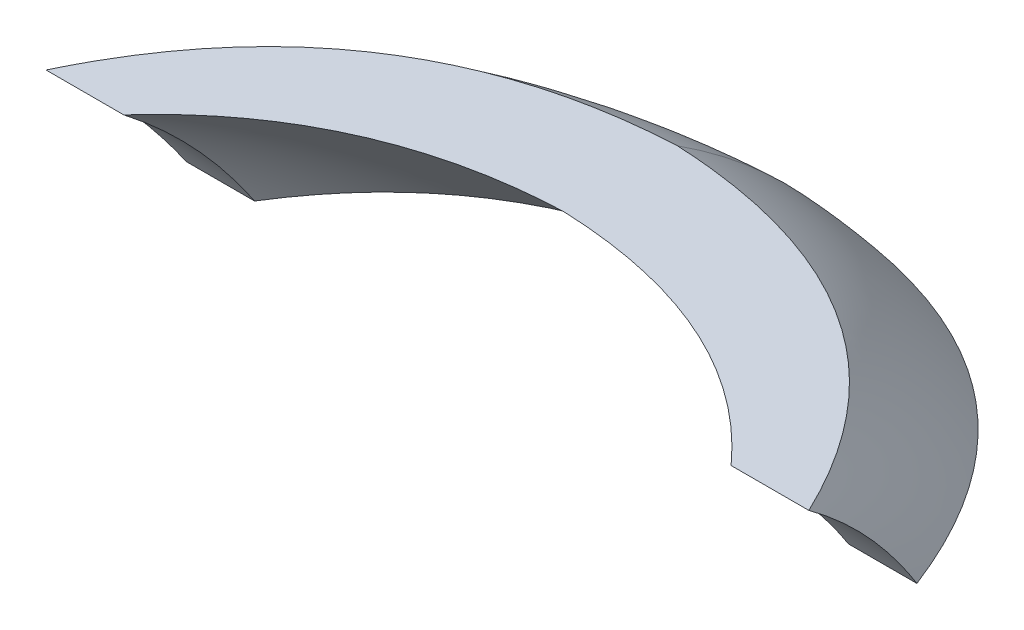
ISO-10303-21;
HEADER;
FILE_DESCRIPTION(('STEP AP214'),'2;1');
FILE_NAME('part.step','',(''),(''),'','','');
FILE_SCHEMA(('AUTOMOTIVE_DESIGN { 1 0 10303 214 1 1 1 1 }'));
ENDSEC;
DATA;
#1=APPLICATION_CONTEXT('core data for automotive mechanical design processes');
#2=APPLICATION_PROTOCOL_DEFINITION('international standard','automotive_design',2000,#1);
#3=PRODUCT_CONTEXT('',#1,'mechanical');
#4=PRODUCT('Part','Part','',(#3));
#5=PRODUCT_RELATED_PRODUCT_CATEGORY('part','',(#4));
#6=PRODUCT_DEFINITION_FORMATION('','',#4);
#7=PRODUCT_DEFINITION_CONTEXT('part definition',#1,'design');
#8=PRODUCT_DEFINITION('design','',#6,#7);
#9=PRODUCT_DEFINITION_SHAPE('','',#8);
#10=(LENGTH_UNIT() NAMED_UNIT(*) SI_UNIT(.MILLI.,.METRE.));
#11=(NAMED_UNIT(*) PLANE_ANGLE_UNIT() SI_UNIT($,.RADIAN.));
#12=(NAMED_UNIT(*) SI_UNIT($,.STERADIAN.) SOLID_ANGLE_UNIT());
#13=UNCERTAINTY_MEASURE_WITH_UNIT(LENGTH_MEASURE(1.E-05),#10,'distance_accuracy_value','');
#14=(GEOMETRIC_REPRESENTATION_CONTEXT(3) GLOBAL_UNCERTAINTY_ASSIGNED_CONTEXT((#13)) GLOBAL_UNIT_ASSIGNED_CONTEXT((#10,
#11,#12)) REPRESENTATION_CONTEXT('',''));
#15=CARTESIAN_POINT('',(0.,0.,0.));
#16=DIRECTION('',(0.,0.,1.));
#17=DIRECTION('',(1.,0.,0.));
#18=AXIS2_PLACEMENT_3D('',#15,#16,#17);
#19=CARTESIAN_POINT('',(1016.93008059215,1447.99219123021,-15258.5674810014));
#20=DIRECTION('',(0.,1.,0.));
#21=DIRECTION('',(0.,0.,1.));
#22=AXIS2_PLACEMENT_3D('',#19,#20,#21);
#23=PLANE('',#22);
#24=CARTESIAN_POINT('',(1656.78813136322,1447.99219123021,-14363.4829944068));
#25=CARTESIAN_POINT('',(1205.46609550268,1447.99219123021,-15527.7011901592));
#26=CARTESIAN_POINT('',(0.,1447.99219123021,-15615.3845492803));
#27=B_SPLINE_CURVE_WITH_KNOTS('',2,(#24,#25,#26),.UNSPECIFIED.,.F.,.F.,(3,3),(0.,1.),.UNSPECIFIED.);
#28=CARTESIAN_POINT('',(1656.78813136322,1447.99219123021,-14363.4829944068));
#29=VERTEX_POINT('',#28);
#30=CARTESIAN_POINT('',(0.,1447.99219123021,-15615.3845492803));
#31=VERTEX_POINT('',#30);
#32=EDGE_CURVE('E464',#29,#31,#27,.T.);
#33=ORIENTED_EDGE('',*,*,#32,.F.);
#34=DIRECTION('',(1.,0.,0.));
#35=VECTOR('',#34,1.);
#36=CARTESIAN_POINT('',(1656.78813136322,1447.99219123021,-14363.4829944068));
#37=LINE('',#36,#35);
#38=CARTESIAN_POINT('',(1346.84741369142,1447.99219123021,-14363.4829944068));
#39=VERTEX_POINT('',#38);
#40=EDGE_CURVE('E633',#39,#29,#37,.T.);
#41=ORIENTED_EDGE('',*,*,#40,.F.);
#42=CARTESIAN_POINT('',(6.90058207712369E-13,1447.99219123021,-15180.0888616126));
#43=CARTESIAN_POINT('',(892.254112882625,1447.99219123021,-15093.5273384483));
#44=CARTESIAN_POINT('',(1346.84741369142,1447.99219123021,-14363.4829944068));
#45=B_SPLINE_CURVE_WITH_KNOTS('',2,(#42,#43,#44),.UNSPECIFIED.,.F.,.F.,(3,3),(0.,1.),.UNSPECIFIED.);
#46=CARTESIAN_POINT('',(8.88178419700125E-13,1447.99219123021,-15180.0888616126));
#47=VERTEX_POINT('',#46);
#48=EDGE_CURVE('E760',#47,#39,#45,.T.);
#49=ORIENTED_EDGE('',*,*,#48,.F.);
#50=CARTESIAN_POINT('',(-1346.84741369142,1447.99219123021,-14363.4829944068));
#51=CARTESIAN_POINT('',(-892.254112882625,1447.99219123021,-15093.5273384483));
#52=CARTESIAN_POINT('',(8.88178419700125E-13,1447.99219123021,-15180.0888616126));
#53=B_SPLINE_CURVE_WITH_KNOTS('',2,(#50,#51,#52),.UNSPECIFIED.,.F.,.F.,(3,3),(0.,1.),.UNSPECIFIED.);
#54=CARTESIAN_POINT('',(-1346.84741369142,1447.99219123021,-14363.4829944068));
#55=VERTEX_POINT('',#54);
#56=EDGE_CURVE('E767',#55,#47,#53,.T.);
#57=ORIENTED_EDGE('',*,*,#56,.F.);
#58=DIRECTION('',(1.,0.,0.));
#59=VECTOR('',#58,1.);
#60=CARTESIAN_POINT('',(-1656.78813136322,1447.99219123021,-14363.4829944068));
#61=LINE('',#60,#59);
#62=CARTESIAN_POINT('',(-1656.78813136322,1447.99219123021,-14363.4829944068));
#63=VERTEX_POINT('',#62);
#64=EDGE_CURVE('E409',#63,#55,#61,.T.);
#65=ORIENTED_EDGE('',*,*,#64,.F.);
#66=CARTESIAN_POINT('',(0.,1447.99219123021,-15615.3845492803));
#67=CARTESIAN_POINT('',(-1205.46609550268,1447.99219123021,-15527.7011901592));
#68=CARTESIAN_POINT('',(-1656.78813136322,1447.99219123021,-14363.4829944068));
#69=B_SPLINE_CURVE_WITH_KNOTS('',2,(#66,#67,#68),.UNSPECIFIED.,.F.,.F.,(3,3),(0.,1.),.UNSPECIFIED.);
#70=EDGE_CURVE('E13',#31,#63,#69,.T.);
#71=ORIENTED_EDGE('',*,*,#70,.F.);
#72=EDGE_LOOP('',(#33,#41,#49,#57,#65,#71));
#73=FACE_BOUND('',#72,.T.);
#74=ADVANCED_FACE('F399',(#73),#23,.F.);
#75=CARTESIAN_POINT('',(1040.25370740718,2052.62960614324,-14622.6430667593));
#76=DIRECTION('',(0.,1.,0.));
#77=DIRECTION('',(0.,0.,1.));
#78=AXIS2_PLACEMENT_3D('',#75,#76,#77);
#79=PLANE('',#78);
#80=CARTESIAN_POINT('',(1729.62097170329,2052.62960614324,-13800.6828504846));
#81=CARTESIAN_POINT('',(1215.69692896272,2052.62960614324,-14877.7168144984));
#82=CARTESIAN_POINT('',(0.,2052.62960614324,-14934.4557875557));
#83=B_SPLINE_CURVE_WITH_KNOTS('',2,(#80,#81,#82),.UNSPECIFIED.,.F.,.F.,(3,3),(0.,1.),.UNSPECIFIED.);
#84=CARTESIAN_POINT('',(1729.62097170329,2052.62960614324,-13800.6828504846));
#85=VERTEX_POINT('',#84);
#86=CARTESIAN_POINT('',(0.,2052.62960614324,-14934.4557875557));
#87=VERTEX_POINT('',#86);
#88=EDGE_CURVE('E461',#85,#87,#83,.T.);
#89=ORIENTED_EDGE('',*,*,#88,.T.);
#90=CARTESIAN_POINT('',(0.,2052.62960614324,-14934.4557875557));
#91=CARTESIAN_POINT('',(-1215.69692896272,2052.62960614324,-14877.7168144984));
#92=CARTESIAN_POINT('',(-1729.62097170329,2052.62960614324,-13800.6828504846));
#93=B_SPLINE_CURVE_WITH_KNOTS('',2,(#90,#91,#92),.UNSPECIFIED.,.F.,.F.,(3,3),(0.,1.),.UNSPECIFIED.);
#94=CARTESIAN_POINT('',(-1729.62097170329,2052.62960614324,-13800.6828504846));
#95=VERTEX_POINT('',#94);
#96=EDGE_CURVE('E468',#87,#95,#93,.T.);
#97=ORIENTED_EDGE('',*,*,#96,.T.);
#98=DIRECTION('',(1.,0.,0.));
#99=VECTOR('',#98,1.);
#100=CARTESIAN_POINT('',(-1729.62097170329,2052.62960614324,-13800.6828504846));
#101=LINE('',#100,#99);
#102=CARTESIAN_POINT('',(-1377.14288614841,2052.62960614324,-13800.6828504846));
#103=VERTEX_POINT('',#102);
#104=EDGE_CURVE('E474',#95,#103,#101,.T.);
#105=ORIENTED_EDGE('',*,*,#104,.T.);
#106=CARTESIAN_POINT('',(-1377.14288614841,2052.62960614324,-13800.6828504846));
#107=CARTESIAN_POINT('',(-850.648259402485,2052.62960614324,-14385.325069701));
#108=CARTESIAN_POINT('',(0.,2052.62960614324,-14418.383322118));
#109=B_SPLINE_CURVE_WITH_KNOTS('',2,(#106,#107,#108),.UNSPECIFIED.,.F.,.F.,(3,3),(0.,1.),.UNSPECIFIED.);
#110=CARTESIAN_POINT('',(0.,2052.62960614324,-14418.383322118));
#111=VERTEX_POINT('',#110);
#112=EDGE_CURVE('E539',#103,#111,#109,.T.);
#113=ORIENTED_EDGE('',*,*,#112,.T.);
#114=CARTESIAN_POINT('',(0.,2052.62960614324,-14418.383322118));
#115=CARTESIAN_POINT('',(850.648259402486,2052.62960614324,-14385.325069701));
#116=CARTESIAN_POINT('',(1377.14288614841,2052.62960614324,-13800.6828504846));
#117=B_SPLINE_CURVE_WITH_KNOTS('',2,(#114,#115,#116),.UNSPECIFIED.,.F.,.F.,(3,3),(0.,1.),.UNSPECIFIED.);
#118=CARTESIAN_POINT('',(1377.14288614841,2052.62960614324,-13800.6828504846));
#119=VERTEX_POINT('',#118);
#120=EDGE_CURVE('E538',#111,#119,#117,.T.);
#121=ORIENTED_EDGE('',*,*,#120,.T.);
#122=DIRECTION('',(1.,0.,0.));
#123=VECTOR('',#122,1.);
#124=CARTESIAN_POINT('',(1729.62097170329,2052.62960614324,-13800.6828504846));
#125=LINE('',#124,#123);
#126=EDGE_CURVE('E480',#119,#85,#125,.T.);
#127=ORIENTED_EDGE('',*,*,#126,.T.);
#128=EDGE_LOOP('',(#89,#97,#105,#113,#121,#127));
#129=FACE_BOUND('',#128,.T.);
#130=ADVANCED_FACE('F478',(#129),#79,.T.);
#131=CARTESIAN_POINT('',(-1729.62097170329,2052.62960614324,-13800.6828504846));
#132=CARTESIAN_POINT('',(-1705.3433582566,1892.12507808438,-14010.5968788398));
#133=CARTESIAN_POINT('',(-1681.06574480991,1694.40801554914,-14201.1676975908));
#134=CARTESIAN_POINT('',(-1656.78813136322,1447.99219123021,-14363.4829944068));
#135=CARTESIAN_POINT('',(-1643.96696457986,2052.62960614324,-13980.1885111536));
#136=CARTESIAN_POINT('',(-1623.16724040428,1892.12507808438,-14194.9461079386));
#137=CARTESIAN_POINT('',(-1602.36751622871,1694.40801554914,-14390.3604951196));
#138=CARTESIAN_POINT('',(-1581.56779205313,1447.99219123021,-14557.5193603656));
#139=CARTESIAN_POINT('',(-1443.41841340709,2052.62960614326,-14296.6875412017));
#140=CARTESIAN_POINT('',(-1428.84709036513,1892.12507808438,-14520.3511658789));
#141=CARTESIAN_POINT('',(-1414.27576732317,1694.40801554914,-14724.6715809519));
#142=CARTESIAN_POINT('',(-1399.70444428121,1447.99219123021,-14900.73647409));
#143=CARTESIAN_POINT('',(-1054.87397587013,2052.62960614324,-14643.8992124042));
#144=CARTESIAN_POINT('',(-1047.46312230276,1892.12507808438,-14878.5785520165));
#145=CARTESIAN_POINT('',(-1040.05226873539,1694.40801554915,-15093.9146820247));
#146=CARTESIAN_POINT('',(-1032.64141516802,1447.99219123022,-15280.9952900979));
#147=CARTESIAN_POINT('',(-578.607927555448,2052.62960614325,-14863.5740097374));
#148=CARTESIAN_POINT('',(-576.17541123683,1892.12507808439,-15106.9257373816));
#149=CARTESIAN_POINT('',(-573.742894918213,1694.40801554915,-15330.9342554218));
#150=CARTESIAN_POINT('',(-571.310378599595,1447.99219123022,-15526.6872515269));
#151=CARTESIAN_POINT('',(-202.61615482712,2052.62960614324,-14924.9992920462));
#152=CARTESIAN_POINT('',(-202.047775190451,1892.12507808438,-15172.5703937763));
#153=CARTESIAN_POINT('',(-201.479395553783,1694.40801554914,-15400.7982859024));
#154=CARTESIAN_POINT('',(-200.911015917114,1447.99219123021,-15600.7706560934));
#155=CARTESIAN_POINT('',(0.,2052.62960614324,-14934.4557875557));
#156=CARTESIAN_POINT('',(0.,1892.12507808438,-15183.746021845));
#157=CARTESIAN_POINT('',(0.,1694.40801554914,-15413.6930465301));
#158=CARTESIAN_POINT('',(0.,1447.99219123021,-15615.3845492803));
#159=B_SPLINE_SURFACE_WITH_KNOTS('',3,3,((#131,#132,#133,#134),(#135,#136,#137,#138),(#139,#140,
#141,#142),(#143,#144,#145,#146),(#147,#148,#149,#150),(#151,#152,#153,#154),(#155,#156,#157,
#158)),.UNSPECIFIED.,.F.,.F.,.F.,(4,1,1,1,4),(4,4),(0.733582610380399,0.800186957785299,
0.8667913051902,0.9333956525951,1.),(0.,1.),.UNSPECIFIED.);
#160=CARTESIAN_POINT('',(0.,2052.62960614324,-14934.4557875557));
#161=CARTESIAN_POINT('',(0.,1892.12507808438,-15183.746021845));
#162=CARTESIAN_POINT('',(0.,1694.40801554914,-15413.6930465301));
#163=CARTESIAN_POINT('',(0.,1447.99219123021,-15615.3845492803));
#164=B_SPLINE_CURVE_WITH_KNOTS('',3,(#160,#161,#162,#163),.UNSPECIFIED.,.F.,.F.,(4,4),(0.,1.),.UNSPECIFIED.);
#165=EDGE_CURVE('E456',#87,#31,#164,.T.);
#166=CARTESIAN_POINT('',(-1729.62097170329,2052.62960614324,-13800.6828504846));
#167=CARTESIAN_POINT('',(-1705.3433582566,1892.12507808438,-14010.5968788398));
#168=CARTESIAN_POINT('',(-1681.06574480991,1694.40801554914,-14201.1676975908));
#169=CARTESIAN_POINT('',(-1656.78813136322,1447.99219123021,-14363.4829944068));
#170=B_SPLINE_CURVE_WITH_KNOTS('',3,(#166,#167,#168,#169),.UNSPECIFIED.,.F.,.F.,(4,4),(0.,1.),.UNSPECIFIED.);
#171=EDGE_CURVE('E417',#95,#63,#170,.T.);
#172=ORIENTED_EDGE('',*,*,#96,.F.);
#173=ORIENTED_EDGE('',*,*,#165,.T.);
#174=ORIENTED_EDGE('',*,*,#70,.T.);
#175=ORIENTED_EDGE('',*,*,#171,.F.);
#176=EDGE_LOOP('',(#172,#173,#174,#175));
#177=FACE_BOUND('',#176,.T.);
#178=ADVANCED_FACE('F470',(#177),#159,.T.);
#179=CARTESIAN_POINT('',(-1377.14288614841,2052.62960614324,-13800.6828504846));
#180=CARTESIAN_POINT('',(-1367.04439532941,1892.12507808438,-14010.5968788398));
#181=CARTESIAN_POINT('',(-1356.94590451041,1694.40801554914,-14201.1676975908));
#182=CARTESIAN_POINT('',(-1346.84741369142,1447.99219123021,-14363.4829944068));
#183=CARTESIAN_POINT('',(-1406.51605994465,2052.62960614324,-13800.6828504846));
#184=CARTESIAN_POINT('',(-1395.23597557334,1892.12507808438,-14010.5968788398));
#185=CARTESIAN_POINT('',(-1383.95589120204,1694.40801554914,-14201.1676975908));
#186=CARTESIAN_POINT('',(-1372.67580683073,1447.99219123021,-14363.4829944068));
#187=CARTESIAN_POINT('',(-1465.26240753713,2052.62960614324,-13800.6828504846));
#188=CARTESIAN_POINT('',(-1451.61913606121,1892.12507808438,-14010.5968788398));
#189=CARTESIAN_POINT('',(-1437.97586458529,1694.40801554914,-14201.1676975908));
#190=CARTESIAN_POINT('',(-1424.33259310937,1447.99219123021,-14363.4829944068));
#191=CARTESIAN_POINT('',(-1553.38192892585,2052.62960614324,-13800.6828504846));
#192=CARTESIAN_POINT('',(-1536.19387679301,1892.12507808438,-14010.5968788398));
#193=CARTESIAN_POINT('',(-1519.00582466016,1694.40801554914,-14201.1676975908));
#194=CARTESIAN_POINT('',(-1501.81777252732,1447.99219123021,-14363.4829944068));
#195=CARTESIAN_POINT('',(-1641.50145031457,2052.62960614324,-13800.6828504846));
#196=CARTESIAN_POINT('',(-1620.7686175248,1892.12507808438,-14010.5968788398));
#197=CARTESIAN_POINT('',(-1600.03578473504,1694.40801554914,-14201.1676975908));
#198=CARTESIAN_POINT('',(-1579.30295194527,1447.99219123021,-14363.4829944068));
#199=CARTESIAN_POINT('',(-1700.24779790705,2052.62960614324,-13800.6828504846));
#200=CARTESIAN_POINT('',(-1677.15177801267,1892.12507808438,-14010.5968788398));
#201=CARTESIAN_POINT('',(-1654.05575811828,1694.40801554914,-14201.1676975908));
#202=CARTESIAN_POINT('',(-1630.9597382239,1447.99219123021,-14363.4829944068));
#203=CARTESIAN_POINT('',(-1729.62097170329,2052.62960614324,-13800.6828504846));
#204=CARTESIAN_POINT('',(-1705.3433582566,1892.12507808438,-14010.5968788398));
#205=CARTESIAN_POINT('',(-1681.06574480991,1694.40801554914,-14201.1676975908));
#206=CARTESIAN_POINT('',(-1656.78813136322,1447.99219123021,-14363.4829944068));
#207=B_SPLINE_SURFACE_WITH_KNOTS('',3,3,((#179,#180,#181,#182),(#183,#184,#185,#186),(#187,#188,
#189,#190),(#191,#192,#193,#194),(#195,#196,#197,#198),(#199,#200,#201,#202),(#203,#204,#205,
#206)),.UNSPECIFIED.,.F.,.F.,.F.,(4,1,1,1,4),(4,4),(0.693392669124958,0.703440154438818,
0.713487639752678,0.723535125066539,0.733582610380399),(0.,1.),.UNSPECIFIED.);
#208=CARTESIAN_POINT('',(-1377.14288614841,2052.62960614324,-13800.6828504846));
#209=CARTESIAN_POINT('',(-1367.04439532941,1892.12507808438,-14010.5968788398));
#210=CARTESIAN_POINT('',(-1356.94590451041,1694.40801554914,-14201.1676975908));
#211=CARTESIAN_POINT('',(-1346.84741369142,1447.99219123021,-14363.4829944068));
#212=B_SPLINE_CURVE_WITH_KNOTS('',3,(#208,#209,#210,#211),.UNSPECIFIED.,.F.,.F.,(4,4),(0.,1.),.UNSPECIFIED.);
#213=EDGE_CURVE('E694',#103,#55,#212,.T.);
#214=ORIENTED_EDGE('',*,*,#104,.F.);
#215=ORIENTED_EDGE('',*,*,#171,.T.);
#216=ORIENTED_EDGE('',*,*,#64,.T.);
#217=ORIENTED_EDGE('',*,*,#213,.F.);
#218=EDGE_LOOP('',(#214,#215,#216,#217));
#219=FACE_BOUND('',#218,.T.);
#220=ADVANCED_FACE('F576',(#219),#207,.T.);
#221=CARTESIAN_POINT('',(0.,2052.62960614324,-14418.383322118));
#222=CARTESIAN_POINT('',(2.96059473233375E-13,1892.12507808438,-14694.5991489973));
#223=CARTESIAN_POINT('',(5.9211894646675E-13,1694.40801554914,-14951.4717662724));
#224=CARTESIAN_POINT('',(8.88178419700125E-13,1447.99219123021,-15180.0888616126));
#225=CARTESIAN_POINT('',(-141.774709900414,2052.62960614324,-14412.8736133818));
#226=CARTESIAN_POINT('',(-144.086146204866,1892.12507808438,-14686.1170363307));
#227=CARTESIAN_POINT('',(-146.397582509318,1694.40801554914,-14940.0172496755));
#228=CARTESIAN_POINT('',(-148.70901881377,1447.99219123021,-15165.6619410852));
#229=CARTESIAN_POINT('',(-411.81772834055,2052.62960614325,-14378.8715306262));
#230=CARTESIAN_POINT('',(-417.175548650888,1892.12507808438,-14644.893772741));
#231=CARTESIAN_POINT('',(-422.533368961226,1694.40801554914,-14891.5728052516));
#232=CARTESIAN_POINT('',(-427.891189271564,1447.99219123021,-15109.9963158272));
#233=CARTESIAN_POINT('',(-776.363051918693,2052.62960614325,-14258.9204106428));
#234=CARTESIAN_POINT('',(-781.560982428811,1892.12507808439,-14510.2817625866));
#235=CARTESIAN_POINT('',(-786.758912938928,1694.40801554915,-14742.2999049261));
#236=CARTESIAN_POINT('',(-791.956843449045,1447.99219123023,-14946.0625253307));
#237=CARTESIAN_POINT('',(-1100.38917141476,2052.62960614325,-14070.0212948096));
#238=CARTESIAN_POINT('',(-1100.6977463156,1892.12507808438,-14302.8926376623));
#239=CARTESIAN_POINT('',(-1101.00632121644,1694.40801554914,-14516.4207709108));
#240=CARTESIAN_POINT('',(-1101.31489611728,1447.99219123021,-14701.6933822244));
#241=CARTESIAN_POINT('',(-1289.39378169075,2052.62960614324,-13898.123220354));
#242=CARTESIAN_POINT('',(-1283.28980897938,1892.12507808438,-14116.1151445328));
#243=CARTESIAN_POINT('',(-1277.185836268,1694.40801554914,-14314.7638591074));
#244=CARTESIAN_POINT('',(-1271.08186355662,1447.99219123021,-14485.1570517471));
#245=CARTESIAN_POINT('',(-1377.14288614841,2052.62960614324,-13800.6828504846));
#246=CARTESIAN_POINT('',(-1367.04439532941,1892.12507808438,-14010.5968788398));
#247=CARTESIAN_POINT('',(-1356.94590451041,1694.40801554914,-14201.1676975908));
#248=CARTESIAN_POINT('',(-1346.84741369142,1447.99219123021,-14363.4829944068));
#249=B_SPLINE_SURFACE_WITH_KNOTS('',3,3,((#221,#222,#223,#224),(#225,#226,#227,#228),(#229,#230,
#231,#232),(#233,#234,#235,#236),(#237,#238,#239,#240),(#241,#242,#243,#244),(#245,#246,#247,
#248)),.UNSPECIFIED.,.F.,.F.,.F.,(4,1,1,1,4),(4,4),(0.499999835116255,0.548348043618431,
0.596696252120607,0.645044460622782,0.693392669124958),(0.,1.),.UNSPECIFIED.);
#250=CARTESIAN_POINT('',(0.,2052.62960614324,-14418.383322118));
#251=CARTESIAN_POINT('',(2.96059473233375E-13,1892.12507808438,-14694.5991489973));
#252=CARTESIAN_POINT('',(5.9211894646675E-13,1694.40801554914,-14951.4717662724));
#253=CARTESIAN_POINT('',(8.88178419700125E-13,1447.99219123021,-15180.0888616126));
#254=B_SPLINE_CURVE_WITH_KNOTS('',3,(#250,#251,#252,#253),.UNSPECIFIED.,.F.,.F.,(4,4),(0.,1.),.UNSPECIFIED.);
#255=EDGE_CURVE('E671',#111,#47,#254,.T.);
#256=ORIENTED_EDGE('',*,*,#112,.F.);
#257=ORIENTED_EDGE('',*,*,#213,.T.);
#258=ORIENTED_EDGE('',*,*,#56,.T.);
#259=ORIENTED_EDGE('',*,*,#255,.F.);
#260=EDGE_LOOP('',(#256,#257,#258,#259));
#261=FACE_BOUND('',#260,.T.);
#262=ADVANCED_FACE('F587',(#261),#249,.T.);
#263=CARTESIAN_POINT('',(1377.14288614841,2052.62960614324,-13800.6828504846));
#264=CARTESIAN_POINT('',(1367.04439532941,1892.12507808438,-14010.5968788398));
#265=CARTESIAN_POINT('',(1356.94590451041,1694.40801554914,-14201.1676975908));
#266=CARTESIAN_POINT('',(1346.84741369142,1447.99219123021,-14363.4829944068));
#267=CARTESIAN_POINT('',(1289.39378169075,2052.62960614324,-13898.123220354));
#268=CARTESIAN_POINT('',(1283.28980897938,1892.12507808438,-14116.1151445328));
#269=CARTESIAN_POINT('',(1277.185836268,1694.40801554914,-14314.7638591074));
#270=CARTESIAN_POINT('',(1271.08186355662,1447.99219123021,-14485.1570517471));
#271=CARTESIAN_POINT('',(1100.38917141476,2052.62960614325,-14070.0212948096));
#272=CARTESIAN_POINT('',(1100.6977463156,1892.12507808438,-14302.8926376623));
#273=CARTESIAN_POINT('',(1101.00632121644,1694.40801554915,-14516.4207709108));
#274=CARTESIAN_POINT('',(1101.31489611728,1447.99219123021,-14701.6933822243));
#275=CARTESIAN_POINT('',(776.363051918693,2052.62960614325,-14258.9204106428));
#276=CARTESIAN_POINT('',(781.560982428808,1892.12507808438,-14510.2817625865));
#277=CARTESIAN_POINT('',(786.758912938924,1694.40801554915,-14742.2999049261));
#278=CARTESIAN_POINT('',(791.95684344904,1447.99219123022,-14946.0625253307));
#279=CARTESIAN_POINT('',(411.817728340555,2052.62960614325,-14378.8715306263));
#280=CARTESIAN_POINT('',(417.175548650894,1892.12507808439,-14644.8937727411));
#281=CARTESIAN_POINT('',(422.533368961233,1694.40801554915,-14891.5728052517));
#282=CARTESIAN_POINT('',(427.891189271572,1447.99219123022,-15109.9963158274));
#283=CARTESIAN_POINT('',(141.774709900414,2052.62960614324,-14412.8736133818));
#284=CARTESIAN_POINT('',(144.086146204867,1892.12507808438,-14686.1170363307));
#285=CARTESIAN_POINT('',(146.397582509319,1694.40801554914,-14940.0172496755));
#286=CARTESIAN_POINT('',(148.709018813771,1447.99219123021,-15165.6619410852));
#287=CARTESIAN_POINT('',(0.,2052.62960614324,-14418.383322118));
#288=CARTESIAN_POINT('',(2.96059473233375E-13,1892.12507808438,-14694.5991489973));
#289=CARTESIAN_POINT('',(5.9211894646675E-13,1694.40801554914,-14951.4717662724));
#290=CARTESIAN_POINT('',(8.88178419700125E-13,1447.99219123021,-15180.0888616126));
#291=B_SPLINE_SURFACE_WITH_KNOTS('',3,3,((#263,#264,#265,#266),(#267,#268,#269,#270),(#271,#272,
#273,#274),(#275,#276,#277,#278),(#279,#280,#281,#282),(#283,#284,#285,#286),(#287,#288,#289,
#290)),.UNSPECIFIED.,.F.,.F.,.F.,(4,1,1,1,4),(4,4),(0.30660732151696,0.354955449916784,
0.403303578316608,0.451651706716432,0.499999835116255),(0.,1.),.UNSPECIFIED.);
#292=CARTESIAN_POINT('',(1377.14288614841,2052.62960614324,-13800.6828504846));
#293=CARTESIAN_POINT('',(1367.04439532941,1892.12507808438,-14010.5968788398));
#294=CARTESIAN_POINT('',(1356.94590451041,1694.40801554914,-14201.1676975908));
#295=CARTESIAN_POINT('',(1346.84741369142,1447.99219123021,-14363.4829944068));
#296=B_SPLINE_CURVE_WITH_KNOTS('',3,(#292,#293,#294,#295),.UNSPECIFIED.,.F.,.F.,(4,4),(0.,1.),.UNSPECIFIED.);
#297=EDGE_CURVE('E664',#119,#39,#296,.T.);
#298=ORIENTED_EDGE('',*,*,#120,.F.);
#299=ORIENTED_EDGE('',*,*,#255,.T.);
#300=ORIENTED_EDGE('',*,*,#48,.T.);
#301=ORIENTED_EDGE('',*,*,#297,.F.);
#302=EDGE_LOOP('',(#298,#299,#300,#301));
#303=FACE_BOUND('',#302,.T.);
#304=ADVANCED_FACE('F648',(#303),#291,.T.);
#305=CARTESIAN_POINT('',(1729.62097170329,2052.62960614324,-13800.6828504846));
#306=CARTESIAN_POINT('',(1705.3433582566,1892.12507808438,-14010.5968788398));
#307=CARTESIAN_POINT('',(1681.06574480991,1694.40801554914,-14201.1676975908));
#308=CARTESIAN_POINT('',(1656.78813136322,1447.99219123021,-14363.4829944068));
#309=CARTESIAN_POINT('',(1700.24779790705,2052.62960614324,-13800.6828504846));
#310=CARTESIAN_POINT('',(1677.15177801267,1892.12507808438,-14010.5968788398));
#311=CARTESIAN_POINT('',(1654.05575811828,1694.40801554914,-14201.1676975908));
#312=CARTESIAN_POINT('',(1630.9597382239,1447.99219123021,-14363.4829944068));
#313=CARTESIAN_POINT('',(1641.50145031457,2052.62960614324,-13800.6828504846));
#314=CARTESIAN_POINT('',(1620.7686175248,1892.12507808438,-14010.5968788398));
#315=CARTESIAN_POINT('',(1600.03578473504,1694.40801554914,-14201.1676975908));
#316=CARTESIAN_POINT('',(1579.30295194527,1447.99219123021,-14363.4829944069));
#317=CARTESIAN_POINT('',(1553.38192892585,2052.62960614324,-13800.6828504846));
#318=CARTESIAN_POINT('',(1536.193876793,1892.12507808438,-14010.5968788398));
#319=CARTESIAN_POINT('',(1519.00582466016,1694.40801554914,-14201.1676975908));
#320=CARTESIAN_POINT('',(1501.81777252732,1447.99219123021,-14363.4829944068));
#321=CARTESIAN_POINT('',(1465.26240753713,2052.62960614324,-13800.6828504846));
#322=CARTESIAN_POINT('',(1451.61913606121,1892.12507808438,-14010.5968788398));
#323=CARTESIAN_POINT('',(1437.97586458529,1694.40801554914,-14201.1676975908));
#324=CARTESIAN_POINT('',(1424.33259310937,1447.99219123021,-14363.4829944068));
#325=CARTESIAN_POINT('',(1406.51605994465,2052.62960614324,-13800.6828504846));
#326=CARTESIAN_POINT('',(1395.23597557334,1892.12507808438,-14010.5968788398));
#327=CARTESIAN_POINT('',(1383.95589120204,1694.40801554914,-14201.1676975908));
#328=CARTESIAN_POINT('',(1372.67580683073,1447.99219123021,-14363.4829944068));
#329=CARTESIAN_POINT('',(1377.14288614841,2052.62960614324,-13800.6828504846));
#330=CARTESIAN_POINT('',(1367.04439532941,1892.12507808438,-14010.5968788398));
#331=CARTESIAN_POINT('',(1356.94590451041,1694.40801554914,-14201.1676975908));
#332=CARTESIAN_POINT('',(1346.84741369142,1447.99219123021,-14363.4829944068));
#333=B_SPLINE_SURFACE_WITH_KNOTS('',3,3,((#305,#306,#307,#308),(#309,#310,#311,#312),(#313,#314,
#315,#316),(#317,#318,#319,#320),(#321,#322,#323,#324),(#325,#326,#327,#328),(#329,#330,#331,
#332)),.UNSPECIFIED.,.F.,.F.,.F.,(4,1,1,1,4),(4,4),(0.266417380261519,0.276464865575379,
0.28651235088924,0.2965598362031,0.30660732151696),(0.,1.),.UNSPECIFIED.);
#334=CARTESIAN_POINT('',(1729.62097170329,2052.62960614324,-13800.6828504846));
#335=CARTESIAN_POINT('',(1705.3433582566,1892.12507808438,-14010.5968788398));
#336=CARTESIAN_POINT('',(1681.06574480991,1694.40801554914,-14201.1676975908));
#337=CARTESIAN_POINT('',(1656.78813136322,1447.99219123021,-14363.4829944068));
#338=B_SPLINE_CURVE_WITH_KNOTS('',3,(#334,#335,#336,#337),.UNSPECIFIED.,.F.,.F.,(4,4),(0.,1.),.UNSPECIFIED.);
#339=EDGE_CURVE('E473',#85,#29,#338,.T.);
#340=ORIENTED_EDGE('',*,*,#126,.F.);
#341=ORIENTED_EDGE('',*,*,#297,.T.);
#342=ORIENTED_EDGE('',*,*,#40,.T.);
#343=ORIENTED_EDGE('',*,*,#339,.F.);
#344=EDGE_LOOP('',(#340,#341,#342,#343));
#345=FACE_BOUND('',#344,.T.);
#346=ADVANCED_FACE('F638',(#345),#333,.T.);
#347=CARTESIAN_POINT('',(0.,2052.62960614324,-14934.4557875557));
#348=CARTESIAN_POINT('',(0.,1892.12507808438,-15183.746021845));
#349=CARTESIAN_POINT('',(0.,1694.40801554914,-15413.6930465301));
#350=CARTESIAN_POINT('',(0.,1447.99219123021,-15615.3845492803));
#351=CARTESIAN_POINT('',(202.61615482712,2052.62960614324,-14924.9992920462));
#352=CARTESIAN_POINT('',(202.047775190451,1892.12507808438,-15172.5703937763));
#353=CARTESIAN_POINT('',(201.479395553783,1694.40801554914,-15400.7982859024));
#354=CARTESIAN_POINT('',(200.911015917114,1447.99219123021,-15600.7706560934));
#355=CARTESIAN_POINT('',(578.607927555438,2052.62960614326,-14863.5740097373));
#356=CARTESIAN_POINT('',(576.175411236821,1892.12507808439,-15106.9257373815));
#357=CARTESIAN_POINT('',(573.742894918205,1694.40801554915,-15330.9342554216));
#358=CARTESIAN_POINT('',(571.310378599588,1447.99219123021,-15526.6872515268));
#359=CARTESIAN_POINT('',(1054.87397587014,2052.62960614324,-14643.8992124042));
#360=CARTESIAN_POINT('',(1047.46312230277,1892.12507808438,-14878.5785520165));
#361=CARTESIAN_POINT('',(1040.0522687354,1694.40801554915,-15093.9146820247));
#362=CARTESIAN_POINT('',(1032.64141516802,1447.99219123022,-15280.9952900979));
#363=CARTESIAN_POINT('',(1443.41841340709,2052.62960614326,-14296.6875412017));
#364=CARTESIAN_POINT('',(1428.84709036513,1892.12507808439,-14520.3511658789));
#365=CARTESIAN_POINT('',(1414.27576732317,1694.40801554915,-14724.671580952));
#366=CARTESIAN_POINT('',(1399.70444428121,1447.99219123022,-14900.7364740901));
#367=CARTESIAN_POINT('',(1643.96696457986,2052.62960614324,-13980.1885111536));
#368=CARTESIAN_POINT('',(1623.16724040428,1892.12507808438,-14194.9461079386));
#369=CARTESIAN_POINT('',(1602.36751622871,1694.40801554914,-14390.3604951196));
#370=CARTESIAN_POINT('',(1581.56779205313,1447.99219123021,-14557.5193603656));
#371=CARTESIAN_POINT('',(1729.62097170329,2052.62960614324,-13800.6828504846));
#372=CARTESIAN_POINT('',(1705.3433582566,1892.12507808438,-14010.5968788398));
#373=CARTESIAN_POINT('',(1681.06574480991,1694.40801554914,-14201.1676975908));
#374=CARTESIAN_POINT('',(1656.78813136322,1447.99219123021,-14363.4829944068));
#375=B_SPLINE_SURFACE_WITH_KNOTS('',3,3,((#347,#348,#349,#350),(#351,#352,#353,#354),(#355,#356,
#357,#358),(#359,#360,#361,#362),(#363,#364,#365,#366),(#367,#368,#369,#370),(#371,#372,#373,
#374)),.UNSPECIFIED.,.F.,.F.,.F.,(4,1,1,1,4),(4,4),(0.,0.0666043450653797,0.133208690130759,
0.199813035196139,0.266417380261519),(0.,1.),.UNSPECIFIED.);
#376=ORIENTED_EDGE('',*,*,#88,.F.);
#377=ORIENTED_EDGE('',*,*,#339,.T.);
#378=ORIENTED_EDGE('',*,*,#32,.T.);
#379=ORIENTED_EDGE('',*,*,#165,.F.);
#380=EDGE_LOOP('',(#376,#377,#378,#379));
#381=FACE_BOUND('',#380,.T.);
#382=ADVANCED_FACE('F458',(#381),#375,.T.);
#383=CLOSED_SHELL('',(#74,#130,#178,#220,#262,#304,#346,#382));
#384=MANIFOLD_SOLID_BREP('B2',#383);
#385=ADVANCED_BREP_SHAPE_REPRESENTATION('',(#18,#384),#14);
#386=SHAPE_DEFINITION_REPRESENTATION(#9,#385);
ENDSEC;
END-ISO-10303-21;
